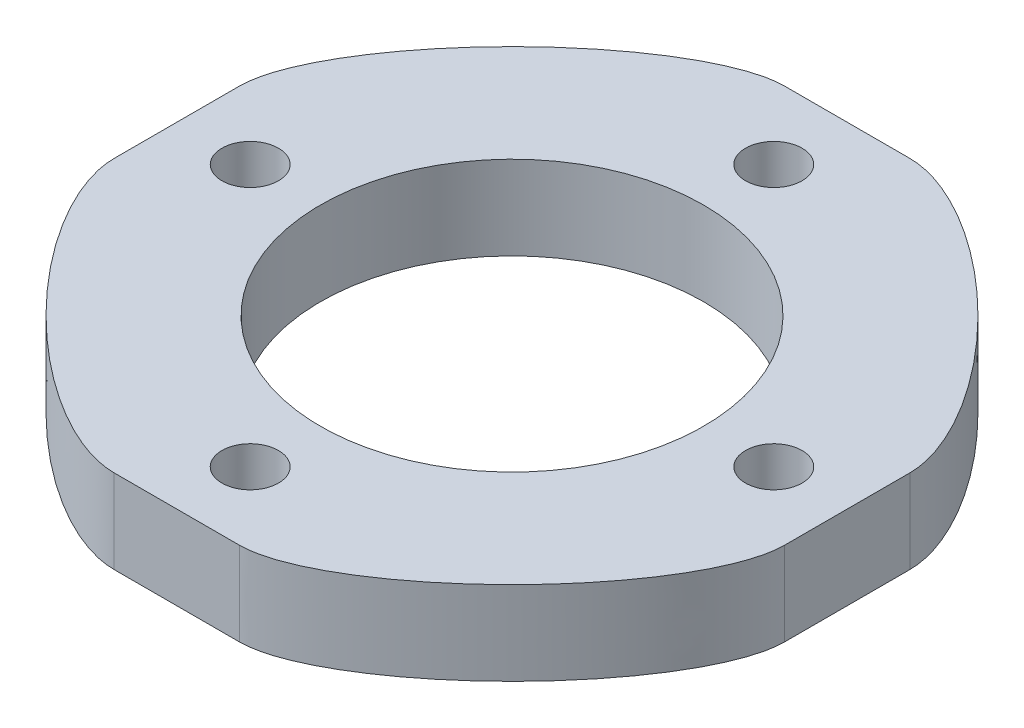
ISO-10303-21;
HEADER;
FILE_DESCRIPTION(('STEP AP214'),'2;1');
FILE_NAME('part.step','',(''),(''),'','','');
FILE_SCHEMA(('AUTOMOTIVE_DESIGN { 1 0 10303 214 1 1 1 1 }'));
ENDSEC;
DATA;
#1=APPLICATION_CONTEXT('core data for automotive mechanical design processes');
#2=APPLICATION_PROTOCOL_DEFINITION('international standard','automotive_design',2000,#1);
#3=PRODUCT_CONTEXT('',#1,'mechanical');
#4=PRODUCT('Part','Part','',(#3));
#5=PRODUCT_RELATED_PRODUCT_CATEGORY('part','',(#4));
#6=PRODUCT_DEFINITION_FORMATION('','',#4);
#7=PRODUCT_DEFINITION_CONTEXT('part definition',#1,'design');
#8=PRODUCT_DEFINITION('design','',#6,#7);
#9=PRODUCT_DEFINITION_SHAPE('','',#8);
#10=(LENGTH_UNIT() NAMED_UNIT(*) SI_UNIT(.MILLI.,.METRE.));
#11=(NAMED_UNIT(*) PLANE_ANGLE_UNIT() SI_UNIT($,.RADIAN.));
#12=(NAMED_UNIT(*) SI_UNIT($,.STERADIAN.) SOLID_ANGLE_UNIT());
#13=UNCERTAINTY_MEASURE_WITH_UNIT(LENGTH_MEASURE(1.E-05),#10,'distance_accuracy_value','');
#14=(GEOMETRIC_REPRESENTATION_CONTEXT(3) GLOBAL_UNCERTAINTY_ASSIGNED_CONTEXT((#13)) GLOBAL_UNIT_ASSIGNED_CONTEXT((#10,
#11,#12)) REPRESENTATION_CONTEXT('',''));
#15=CARTESIAN_POINT('',(0.,0.,0.));
#16=DIRECTION('',(0.,0.,1.));
#17=DIRECTION('',(1.,0.,0.));
#18=AXIS2_PLACEMENT_3D('',#15,#16,#17);
#19=CARTESIAN_POINT('',(0.,4.,0.));
#20=DIRECTION('',(1.,0.,0.));
#21=DIRECTION('',(0.,0.,-1.));
#22=AXIS2_PLACEMENT_3D('',#19,#20,#21);
#23=PLANE('',#22);
#24=DIRECTION('',(0.,0.,1.));
#25=VECTOR('',#24,1.);
#26=CARTESIAN_POINT('',(0.,4.,0.));
#27=LINE('',#26,#25);
#28=CARTESIAN_POINT('',(0.,4.,13.));
#29=VERTEX_POINT('',#28);
#30=CARTESIAN_POINT('',(0.,4.,19.));
#31=VERTEX_POINT('',#30);
#32=EDGE_CURVE('E137',#29,#31,#27,.T.);
#33=ORIENTED_EDGE('',*,*,#32,.F.);
#34=CARTESIAN_POINT('',(0.,-0.200000000000001,13.));
#35=CARTESIAN_POINT('',(0.,1.26666666666667,13.));
#36=CARTESIAN_POINT('',(0.,2.73333333333333,13.));
#37=CARTESIAN_POINT('',(0.,4.2,13.));
#38=(BOUNDED_CURVE() B_SPLINE_CURVE(3,(#34,#35,#36,#37),.UNSPECIFIED.,.F.,
.F.) B_SPLINE_CURVE_WITH_KNOTS((4,4),(-0.0002,0.0042),
.UNSPECIFIED.) CURVE() GEOMETRIC_REPRESENTATION_ITEM() RATIONAL_B_SPLINE_CURVE((1.,1.,1.,1.)) REPRESENTATION_ITEM(''));
#39=CARTESIAN_POINT('',(0.,0.,13.));
#40=VERTEX_POINT('',#39);
#41=EDGE_CURVE('E117',#29,#40,#38,.F.);
#42=ORIENTED_EDGE('',*,*,#41,.T.);
#43=DIRECTION('',(0.,0.,1.));
#44=VECTOR('',#43,1.);
#45=CARTESIAN_POINT('',(0.,0.,0.));
#46=LINE('',#45,#44);
#47=CARTESIAN_POINT('',(0.,0.,19.));
#48=VERTEX_POINT('',#47);
#49=EDGE_CURVE('E134',#40,#48,#46,.T.);
#50=ORIENTED_EDGE('',*,*,#49,.T.);
#51=CARTESIAN_POINT('',(0.,4.2,19.));
#52=CARTESIAN_POINT('',(0.,2.73333333333333,19.));
#53=CARTESIAN_POINT('',(0.,1.26666666666667,19.));
#54=CARTESIAN_POINT('',(0.,-0.200000000000001,19.));
#55=(BOUNDED_CURVE() B_SPLINE_CURVE(3,(#51,#52,#53,#54),.UNSPECIFIED.,.F.,
.F.) B_SPLINE_CURVE_WITH_KNOTS((4,4),(-0.0002,0.0042),
.UNSPECIFIED.) CURVE() GEOMETRIC_REPRESENTATION_ITEM() RATIONAL_B_SPLINE_CURVE((1.,1.,1.,1.)) REPRESENTATION_ITEM(''));
#56=EDGE_CURVE('E139',#48,#31,#55,.F.);
#57=ORIENTED_EDGE('',*,*,#56,.T.);
#58=EDGE_LOOP('',(#33,#42,#50,#57));
#59=FACE_BOUND('',#58,.T.);
#60=ADVANCED_FACE('F38',(#59),#23,.F.);
#61=CARTESIAN_POINT('',(0.,4.,32.));
#62=DIRECTION('',(0.,0.,-1.));
#63=DIRECTION('',(-1.,0.,0.));
#64=AXIS2_PLACEMENT_3D('',#61,#62,#63);
#65=PLANE('',#64);
#66=DIRECTION('',(1.,0.,0.));
#67=VECTOR('',#66,1.);
#68=CARTESIAN_POINT('',(0.,0.,32.));
#69=LINE('',#68,#67);
#70=CARTESIAN_POINT('',(13.,0.,32.));
#71=VERTEX_POINT('',#70);
#72=CARTESIAN_POINT('',(19.,0.,32.));
#73=VERTEX_POINT('',#72);
#74=EDGE_CURVE('E145',#71,#73,#69,.T.);
#75=ORIENTED_EDGE('',*,*,#74,.T.);
#76=CARTESIAN_POINT('',(19.,4.2,32.));
#77=CARTESIAN_POINT('',(19.,2.73333333333333,32.));
#78=CARTESIAN_POINT('',(19.,1.26666666666667,32.));
#79=CARTESIAN_POINT('',(19.,-0.200000000000001,32.));
#80=(BOUNDED_CURVE() B_SPLINE_CURVE(3,(#76,#77,#78,#79),.UNSPECIFIED.,.F.,
.F.) B_SPLINE_CURVE_WITH_KNOTS((4,4),(-0.0002,0.0042),
.UNSPECIFIED.) CURVE() GEOMETRIC_REPRESENTATION_ITEM() RATIONAL_B_SPLINE_CURVE((1.,1.,1.,1.)) REPRESENTATION_ITEM(''));
#81=CARTESIAN_POINT('',(19.,4.,32.));
#82=VERTEX_POINT('',#81);
#83=EDGE_CURVE('E12',#73,#82,#80,.F.);
#84=ORIENTED_EDGE('',*,*,#83,.T.);
#85=DIRECTION('',(1.,0.,0.));
#86=VECTOR('',#85,1.);
#87=CARTESIAN_POINT('',(0.,4.,32.));
#88=LINE('',#87,#86);
#89=CARTESIAN_POINT('',(13.,4.,32.));
#90=VERTEX_POINT('',#89);
#91=EDGE_CURVE('E237',#90,#82,#88,.T.);
#92=ORIENTED_EDGE('',*,*,#91,.F.);
#93=CARTESIAN_POINT('',(13.,-0.200000000000001,32.));
#94=CARTESIAN_POINT('',(13.,1.26666666666667,32.));
#95=CARTESIAN_POINT('',(13.,2.73333333333333,32.));
#96=CARTESIAN_POINT('',(13.,4.2,32.));
#97=(BOUNDED_CURVE() B_SPLINE_CURVE(3,(#93,#94,#95,#96),.UNSPECIFIED.,.F.,
.F.) B_SPLINE_CURVE_WITH_KNOTS((4,4),(-0.0002,0.0042),
.UNSPECIFIED.) CURVE() GEOMETRIC_REPRESENTATION_ITEM() RATIONAL_B_SPLINE_CURVE((1.,1.,1.,1.)) REPRESENTATION_ITEM(''));
#98=EDGE_CURVE('E52',#90,#71,#97,.F.);
#99=ORIENTED_EDGE('',*,*,#98,.T.);
#100=EDGE_LOOP('',(#75,#84,#92,#99));
#101=FACE_BOUND('',#100,.T.);
#102=ADVANCED_FACE('F306',(#101),#65,.F.);
#103=CARTESIAN_POINT('',(32.,4.,0.));
#104=DIRECTION('',(-1.,0.,0.));
#105=DIRECTION('',(0.,0.,1.));
#106=AXIS2_PLACEMENT_3D('',#103,#104,#105);
#107=PLANE('',#106);
#108=DIRECTION('',(0.,0.,-1.));
#109=VECTOR('',#108,1.);
#110=CARTESIAN_POINT('',(32.,0.,0.));
#111=LINE('',#110,#109);
#112=CARTESIAN_POINT('',(32.,0.,19.));
#113=VERTEX_POINT('',#112);
#114=CARTESIAN_POINT('',(32.,0.,13.));
#115=VERTEX_POINT('',#114);
#116=EDGE_CURVE('E149',#113,#115,#111,.T.);
#117=ORIENTED_EDGE('',*,*,#116,.T.);
#118=CARTESIAN_POINT('',(32.,4.2,13.));
#119=CARTESIAN_POINT('',(32.,2.73333333333333,13.));
#120=CARTESIAN_POINT('',(32.,1.26666666666667,13.));
#121=CARTESIAN_POINT('',(32.,-0.200000000000001,13.));
#122=(BOUNDED_CURVE() B_SPLINE_CURVE(3,(#118,#119,#120,#121),.UNSPECIFIED.,.F.,
.F.) B_SPLINE_CURVE_WITH_KNOTS((4,4),(-0.0002,0.0042),
.UNSPECIFIED.) CURVE() GEOMETRIC_REPRESENTATION_ITEM() RATIONAL_B_SPLINE_CURVE((1.,1.,1.,1.)) REPRESENTATION_ITEM(''));
#123=CARTESIAN_POINT('',(32.,4.,13.));
#124=VERTEX_POINT('',#123);
#125=EDGE_CURVE('E59',#115,#124,#122,.F.);
#126=ORIENTED_EDGE('',*,*,#125,.T.);
#127=DIRECTION('',(0.,0.,-1.));
#128=VECTOR('',#127,1.);
#129=CARTESIAN_POINT('',(32.,4.,0.));
#130=LINE('',#129,#128);
#131=CARTESIAN_POINT('',(32.,4.,19.));
#132=VERTEX_POINT('',#131);
#133=EDGE_CURVE('E219',#132,#124,#130,.T.);
#134=ORIENTED_EDGE('',*,*,#133,.F.);
#135=CARTESIAN_POINT('',(32.,-0.200000000000001,19.));
#136=CARTESIAN_POINT('',(32.,1.26666666666667,19.));
#137=CARTESIAN_POINT('',(32.,2.73333333333333,19.));
#138=CARTESIAN_POINT('',(32.,4.2,19.));
#139=(BOUNDED_CURVE() B_SPLINE_CURVE(3,(#135,#136,#137,#138),.UNSPECIFIED.,.F.,
.F.) B_SPLINE_CURVE_WITH_KNOTS((4,4),(-0.0002,0.0042),
.UNSPECIFIED.) CURVE() GEOMETRIC_REPRESENTATION_ITEM() RATIONAL_B_SPLINE_CURVE((1.,1.,1.,1.)) REPRESENTATION_ITEM(''));
#140=EDGE_CURVE('E337',#132,#113,#139,.F.);
#141=ORIENTED_EDGE('',*,*,#140,.T.);
#142=EDGE_LOOP('',(#117,#126,#134,#141));
#143=FACE_BOUND('',#142,.T.);
#144=ADVANCED_FACE('F312',(#143),#107,.F.);
#145=CARTESIAN_POINT('',(0.,4.,0.));
#146=DIRECTION('',(0.,0.,1.));
#147=DIRECTION('',(1.,0.,0.));
#148=AXIS2_PLACEMENT_3D('',#145,#146,#147);
#149=PLANE('',#148);
#150=DIRECTION('',(-1.,0.,0.));
#151=VECTOR('',#150,1.);
#152=CARTESIAN_POINT('',(0.,0.,0.));
#153=LINE('',#152,#151);
#154=CARTESIAN_POINT('',(19.,0.,0.));
#155=VERTEX_POINT('',#154);
#156=CARTESIAN_POINT('',(13.,0.,0.));
#157=VERTEX_POINT('',#156);
#158=EDGE_CURVE('E328',#155,#157,#153,.T.);
#159=ORIENTED_EDGE('',*,*,#158,.T.);
#160=CARTESIAN_POINT('',(13.,4.2,0.));
#161=CARTESIAN_POINT('',(13.,2.73333333333333,0.));
#162=CARTESIAN_POINT('',(13.,1.26666666666667,0.));
#163=CARTESIAN_POINT('',(13.,-0.200000000000001,0.));
#164=(BOUNDED_CURVE() B_SPLINE_CURVE(3,(#160,#161,#162,#163),.UNSPECIFIED.,.F.,
.F.) B_SPLINE_CURVE_WITH_KNOTS((4,4),(-0.0002,0.0042),
.UNSPECIFIED.) CURVE() GEOMETRIC_REPRESENTATION_ITEM() RATIONAL_B_SPLINE_CURVE((1.,1.,1.,1.)) REPRESENTATION_ITEM(''));
#165=CARTESIAN_POINT('',(13.,4.,0.));
#166=VERTEX_POINT('',#165);
#167=EDGE_CURVE('E119',#157,#166,#164,.F.);
#168=ORIENTED_EDGE('',*,*,#167,.T.);
#169=DIRECTION('',(-1.,0.,0.));
#170=VECTOR('',#169,1.);
#171=CARTESIAN_POINT('',(0.,4.,0.));
#172=LINE('',#171,#170);
#173=CARTESIAN_POINT('',(19.,4.,0.));
#174=VERTEX_POINT('',#173);
#175=EDGE_CURVE('E211',#174,#166,#172,.T.);
#176=ORIENTED_EDGE('',*,*,#175,.F.);
#177=CARTESIAN_POINT('',(19.,-0.200000000000001,0.));
#178=CARTESIAN_POINT('',(19.,1.26666666666667,0.));
#179=CARTESIAN_POINT('',(19.,2.73333333333333,0.));
#180=CARTESIAN_POINT('',(19.,4.2,0.));
#181=(BOUNDED_CURVE() B_SPLINE_CURVE(3,(#177,#178,#179,#180),.UNSPECIFIED.,.F.,
.F.) B_SPLINE_CURVE_WITH_KNOTS((4,4),(-0.0002,0.0042),
.UNSPECIFIED.) CURVE() GEOMETRIC_REPRESENTATION_ITEM() RATIONAL_B_SPLINE_CURVE((1.,1.,1.,1.)) REPRESENTATION_ITEM(''));
#182=EDGE_CURVE('E126',#174,#155,#181,.F.);
#183=ORIENTED_EDGE('',*,*,#182,.T.);
#184=EDGE_LOOP('',(#159,#168,#176,#183));
#185=FACE_BOUND('',#184,.T.);
#186=ADVANCED_FACE('F190',(#185),#149,.F.);
#187=CARTESIAN_POINT('',(0.,4.,0.));
#188=DIRECTION('',(0.,1.,0.));
#189=DIRECTION('',(0.,0.,1.));
#190=AXIS2_PLACEMENT_3D('',#187,#188,#189);
#191=PLANE('',#190);
#192=CARTESIAN_POINT('',(3.5,4.,16.));
#193=DIRECTION('',(0.,-1.,0.));
#194=DIRECTION('',(0.,0.,-1.));
#195=AXIS2_PLACEMENT_3D('',#192,#193,#194);
#196=CIRCLE('',#195,1.35);
#197=CARTESIAN_POINT('',(3.5,4.,14.65));
#198=VERTEX_POINT('',#197);
#199=EDGE_CURVE('E268',#198,#198,#196,.T.);
#200=ORIENTED_EDGE('',*,*,#199,.T.);
#201=EDGE_LOOP('',(#200));
#202=FACE_BOUND('',#201,.T.);
#203=CARTESIAN_POINT('',(16.,4.,3.5));
#204=DIRECTION('',(0.,-1.,0.));
#205=DIRECTION('',(0.,0.,-1.));
#206=AXIS2_PLACEMENT_3D('',#203,#204,#205);
#207=CIRCLE('',#206,1.35);
#208=CARTESIAN_POINT('',(16.,4.,2.15));
#209=VERTEX_POINT('',#208);
#210=EDGE_CURVE('E257',#209,#209,#207,.T.);
#211=ORIENTED_EDGE('',*,*,#210,.T.);
#212=EDGE_LOOP('',(#211));
#213=FACE_BOUND('',#212,.T.);
#214=CARTESIAN_POINT('',(28.5,4.,16.));
#215=DIRECTION('',(0.,-1.,0.));
#216=DIRECTION('',(0.,0.,-1.));
#217=AXIS2_PLACEMENT_3D('',#214,#215,#216);
#218=CIRCLE('',#217,1.35);
#219=CARTESIAN_POINT('',(28.5,4.,14.65));
#220=VERTEX_POINT('',#219);
#221=EDGE_CURVE('E256',#220,#220,#218,.T.);
#222=ORIENTED_EDGE('',*,*,#221,.T.);
#223=EDGE_LOOP('',(#222));
#224=FACE_BOUND('',#223,.T.);
#225=CARTESIAN_POINT('',(16.,4.,28.5));
#226=DIRECTION('',(0.,-1.,0.));
#227=DIRECTION('',(0.,0.,-1.));
#228=AXIS2_PLACEMENT_3D('',#225,#226,#227);
#229=CIRCLE('',#228,1.35);
#230=CARTESIAN_POINT('',(16.,4.,27.15));
#231=VERTEX_POINT('',#230);
#232=EDGE_CURVE('E251',#231,#231,#229,.T.);
#233=ORIENTED_EDGE('',*,*,#232,.T.);
#234=EDGE_LOOP('',(#233));
#235=FACE_BOUND('',#234,.T.);
#236=CARTESIAN_POINT('',(16.,4.,16.));
#237=DIRECTION('',(0.,-1.,0.));
#238=DIRECTION('',(0.,0.,-1.));
#239=AXIS2_PLACEMENT_3D('',#236,#237,#238);
#240=CIRCLE('',#239,9.15);
#241=CARTESIAN_POINT('',(16.,4.,6.85));
#242=VERTEX_POINT('',#241);
#243=EDGE_CURVE('E146',#242,#242,#240,.T.);
#244=ORIENTED_EDGE('',*,*,#243,.T.);
#245=EDGE_LOOP('',(#244));
#246=FACE_BOUND('',#245,.T.);
#247=ORIENTED_EDGE('',*,*,#175,.T.);
#248=CARTESIAN_POINT('',(0.,4.,13.));
#249=CARTESIAN_POINT('',(0.,4.,0.));
#250=CARTESIAN_POINT('',(13.,4.,0.));
#251=(BOUNDED_CURVE() B_SPLINE_CURVE(2,(#248,#249,#250),.UNSPECIFIED.,.F.,
.F.) B_SPLINE_CURVE_WITH_KNOTS((3,3),(0.,1.),
.UNSPECIFIED.) CURVE() GEOMETRIC_REPRESENTATION_ITEM() RATIONAL_B_SPLINE_CURVE((1.,
0.333333333333333,1.)) REPRESENTATION_ITEM(''));
#252=EDGE_CURVE('E394',#166,#29,#251,.F.);
#253=ORIENTED_EDGE('',*,*,#252,.T.);
#254=ORIENTED_EDGE('',*,*,#32,.T.);
#255=CARTESIAN_POINT('',(13.,4.,32.));
#256=CARTESIAN_POINT('',(0.,4.,32.));
#257=CARTESIAN_POINT('',(0.,4.,19.));
#258=(BOUNDED_CURVE() B_SPLINE_CURVE(2,(#255,#256,#257),.UNSPECIFIED.,.F.,
.F.) B_SPLINE_CURVE_WITH_KNOTS((3,3),(0.,1.),
.UNSPECIFIED.) CURVE() GEOMETRIC_REPRESENTATION_ITEM() RATIONAL_B_SPLINE_CURVE((1.,
0.333333333333333,1.)) REPRESENTATION_ITEM(''));
#259=EDGE_CURVE('E391',#31,#90,#258,.F.);
#260=ORIENTED_EDGE('',*,*,#259,.T.);
#261=ORIENTED_EDGE('',*,*,#91,.T.);
#262=CARTESIAN_POINT('',(32.,4.,19.));
#263=CARTESIAN_POINT('',(32.,4.,32.));
#264=CARTESIAN_POINT('',(19.,4.,32.));
#265=(BOUNDED_CURVE() B_SPLINE_CURVE(2,(#262,#263,#264),.UNSPECIFIED.,.F.,
.F.) B_SPLINE_CURVE_WITH_KNOTS((3,3),(0.,1.),
.UNSPECIFIED.) CURVE() GEOMETRIC_REPRESENTATION_ITEM() RATIONAL_B_SPLINE_CURVE((1.,
0.333333333333333,1.)) REPRESENTATION_ITEM(''));
#266=EDGE_CURVE('E67',#82,#132,#265,.F.);
#267=ORIENTED_EDGE('',*,*,#266,.T.);
#268=ORIENTED_EDGE('',*,*,#133,.T.);
#269=CARTESIAN_POINT('',(19.,4.,0.));
#270=CARTESIAN_POINT('',(32.,4.,0.));
#271=CARTESIAN_POINT('',(32.,4.,13.));
#272=(BOUNDED_CURVE() B_SPLINE_CURVE(2,(#269,#270,#271),.UNSPECIFIED.,.F.,
.F.) B_SPLINE_CURVE_WITH_KNOTS((3,3),(0.,1.),
.UNSPECIFIED.) CURVE() GEOMETRIC_REPRESENTATION_ITEM() RATIONAL_B_SPLINE_CURVE((1.,
0.333333333333333,1.)) REPRESENTATION_ITEM(''));
#273=EDGE_CURVE('E344',#124,#174,#272,.F.);
#274=ORIENTED_EDGE('',*,*,#273,.T.);
#275=EDGE_LOOP('',(#247,#253,#254,#260,#261,#267,#268,#274));
#276=FACE_BOUND('',#275,.T.);
#277=ADVANCED_FACE('F186',(#202,#213,#224,#235,#246,#276),#191,.T.);
#278=CARTESIAN_POINT('',(0.,0.,0.));
#279=DIRECTION('',(0.,1.,0.));
#280=DIRECTION('',(0.,0.,1.));
#281=AXIS2_PLACEMENT_3D('',#278,#279,#280);
#282=PLANE('',#281);
#283=CARTESIAN_POINT('',(3.5,0.,16.));
#284=DIRECTION('',(0.,-1.,0.));
#285=DIRECTION('',(0.,0.,-1.));
#286=AXIS2_PLACEMENT_3D('',#283,#284,#285);
#287=CIRCLE('',#286,1.35);
#288=CARTESIAN_POINT('',(3.5,0.,14.65));
#289=VERTEX_POINT('',#288);
#290=EDGE_CURVE('E265',#289,#289,#287,.T.);
#291=ORIENTED_EDGE('',*,*,#290,.F.);
#292=EDGE_LOOP('',(#291));
#293=FACE_BOUND('',#292,.T.);
#294=CARTESIAN_POINT('',(16.,0.,3.5));
#295=DIRECTION('',(0.,-1.,0.));
#296=DIRECTION('',(0.,0.,-1.));
#297=AXIS2_PLACEMENT_3D('',#294,#295,#296);
#298=CIRCLE('',#297,1.35);
#299=CARTESIAN_POINT('',(16.,0.,2.15));
#300=VERTEX_POINT('',#299);
#301=EDGE_CURVE('E271',#300,#300,#298,.T.);
#302=ORIENTED_EDGE('',*,*,#301,.F.);
#303=EDGE_LOOP('',(#302));
#304=FACE_BOUND('',#303,.T.);
#305=CARTESIAN_POINT('',(28.5,0.,16.));
#306=DIRECTION('',(0.,-1.,0.));
#307=DIRECTION('',(0.,0.,-1.));
#308=AXIS2_PLACEMENT_3D('',#305,#306,#307);
#309=CIRCLE('',#308,1.35);
#310=CARTESIAN_POINT('',(28.5,0.,14.65));
#311=VERTEX_POINT('',#310);
#312=EDGE_CURVE('E253',#311,#311,#309,.T.);
#313=ORIENTED_EDGE('',*,*,#312,.F.);
#314=EDGE_LOOP('',(#313));
#315=FACE_BOUND('',#314,.T.);
#316=CARTESIAN_POINT('',(16.,0.,28.5));
#317=DIRECTION('',(0.,-1.,0.));
#318=DIRECTION('',(0.,0.,-1.));
#319=AXIS2_PLACEMENT_3D('',#316,#317,#318);
#320=CIRCLE('',#319,1.35);
#321=CARTESIAN_POINT('',(16.,0.,27.15));
#322=VERTEX_POINT('',#321);
#323=EDGE_CURVE('E260',#322,#322,#320,.T.);
#324=ORIENTED_EDGE('',*,*,#323,.F.);
#325=EDGE_LOOP('',(#324));
#326=FACE_BOUND('',#325,.T.);
#327=CARTESIAN_POINT('',(16.,0.,16.));
#328=DIRECTION('',(0.,-1.,0.));
#329=DIRECTION('',(0.,0.,-1.));
#330=AXIS2_PLACEMENT_3D('',#327,#328,#329);
#331=CIRCLE('',#330,9.15);
#332=CARTESIAN_POINT('',(16.,0.,6.85));
#333=VERTEX_POINT('',#332);
#334=EDGE_CURVE('E152',#333,#333,#331,.T.);
#335=ORIENTED_EDGE('',*,*,#334,.F.);
#336=EDGE_LOOP('',(#335));
#337=FACE_BOUND('',#336,.T.);
#338=ORIENTED_EDGE('',*,*,#49,.F.);
#339=CARTESIAN_POINT('',(13.,0.,0.));
#340=CARTESIAN_POINT('',(0.,0.,0.));
#341=CARTESIAN_POINT('',(0.,0.,13.));
#342=(BOUNDED_CURVE() B_SPLINE_CURVE(2,(#339,#340,#341),.UNSPECIFIED.,.F.,
.F.) B_SPLINE_CURVE_WITH_KNOTS((3,3),(0.,1.),
.UNSPECIFIED.) CURVE() GEOMETRIC_REPRESENTATION_ITEM() RATIONAL_B_SPLINE_CURVE((1.,
0.333333333333333,1.)) REPRESENTATION_ITEM(''));
#343=EDGE_CURVE('E112',#40,#157,#342,.F.);
#344=ORIENTED_EDGE('',*,*,#343,.T.);
#345=ORIENTED_EDGE('',*,*,#158,.F.);
#346=CARTESIAN_POINT('',(32.,0.,13.));
#347=CARTESIAN_POINT('',(32.,0.,0.));
#348=CARTESIAN_POINT('',(19.,0.,0.));
#349=(BOUNDED_CURVE() B_SPLINE_CURVE(2,(#346,#347,#348),.UNSPECIFIED.,.F.,
.F.) B_SPLINE_CURVE_WITH_KNOTS((3,3),(0.,1.),
.UNSPECIFIED.) CURVE() GEOMETRIC_REPRESENTATION_ITEM() RATIONAL_B_SPLINE_CURVE((1.,
0.333333333333333,1.)) REPRESENTATION_ITEM(''));
#350=EDGE_CURVE('E127',#155,#115,#349,.F.);
#351=ORIENTED_EDGE('',*,*,#350,.T.);
#352=ORIENTED_EDGE('',*,*,#116,.F.);
#353=CARTESIAN_POINT('',(19.,0.,32.));
#354=CARTESIAN_POINT('',(32.,0.,32.));
#355=CARTESIAN_POINT('',(32.,0.,19.));
#356=(BOUNDED_CURVE() B_SPLINE_CURVE(2,(#353,#354,#355),.UNSPECIFIED.,.F.,
.F.) B_SPLINE_CURVE_WITH_KNOTS((3,3),(0.,1.),
.UNSPECIFIED.) CURVE() GEOMETRIC_REPRESENTATION_ITEM() RATIONAL_B_SPLINE_CURVE((1.,
0.333333333333333,1.)) REPRESENTATION_ITEM(''));
#357=EDGE_CURVE('E603',#113,#73,#356,.F.);
#358=ORIENTED_EDGE('',*,*,#357,.T.);
#359=ORIENTED_EDGE('',*,*,#74,.F.);
#360=CARTESIAN_POINT('',(0.,0.,19.));
#361=CARTESIAN_POINT('',(0.,0.,32.));
#362=CARTESIAN_POINT('',(13.,0.,32.));
#363=(BOUNDED_CURVE() B_SPLINE_CURVE(2,(#360,#361,#362),.UNSPECIFIED.,.F.,
.F.) B_SPLINE_CURVE_WITH_KNOTS((3,3),(0.,1.),
.UNSPECIFIED.) CURVE() GEOMETRIC_REPRESENTATION_ITEM() RATIONAL_B_SPLINE_CURVE((1.,
0.333333333333333,1.)) REPRESENTATION_ITEM(''));
#364=EDGE_CURVE('E138',#71,#48,#363,.F.);
#365=ORIENTED_EDGE('',*,*,#364,.T.);
#366=EDGE_LOOP('',(#338,#344,#345,#351,#352,#358,#359,#365));
#367=FACE_BOUND('',#366,.T.);
#368=ADVANCED_FACE('F142',(#293,#304,#315,#326,#337,#367),#282,.F.);
#369=CARTESIAN_POINT('',(16.,4.,16.));
#370=DIRECTION('',(0.,-1.,0.));
#371=DIRECTION('',(0.,0.,-1.));
#372=AXIS2_PLACEMENT_3D('',#369,#370,#371);
#373=CYLINDRICAL_SURFACE('',#372,9.15);
#374=ORIENTED_EDGE('',*,*,#243,.F.);
#375=EDGE_LOOP('',(#374));
#376=FACE_BOUND('',#375,.T.);
#377=ORIENTED_EDGE('',*,*,#334,.T.);
#378=EDGE_LOOP('',(#377));
#379=FACE_BOUND('',#378,.T.);
#380=ADVANCED_FACE('F185',(#376,#379),#373,.F.);
#381=CARTESIAN_POINT('',(16.,4.,28.5));
#382=DIRECTION('',(0.,-1.,0.));
#383=DIRECTION('',(0.,0.,-1.));
#384=AXIS2_PLACEMENT_3D('',#381,#382,#383);
#385=CYLINDRICAL_SURFACE('',#384,1.35);
#386=ORIENTED_EDGE('',*,*,#232,.F.);
#387=EDGE_LOOP('',(#386));
#388=FACE_BOUND('',#387,.T.);
#389=ORIENTED_EDGE('',*,*,#323,.T.);
#390=EDGE_LOOP('',(#389));
#391=FACE_BOUND('',#390,.T.);
#392=ADVANCED_FACE('F295',(#388,#391),#385,.F.);
#393=CARTESIAN_POINT('',(28.5,4.,16.));
#394=DIRECTION('',(0.,-1.,0.));
#395=DIRECTION('',(0.,0.,-1.));
#396=AXIS2_PLACEMENT_3D('',#393,#394,#395);
#397=CYLINDRICAL_SURFACE('',#396,1.35);
#398=ORIENTED_EDGE('',*,*,#221,.F.);
#399=EDGE_LOOP('',(#398));
#400=FACE_BOUND('',#399,.T.);
#401=ORIENTED_EDGE('',*,*,#312,.T.);
#402=EDGE_LOOP('',(#401));
#403=FACE_BOUND('',#402,.T.);
#404=ADVANCED_FACE('F283',(#400,#403),#397,.F.);
#405=CARTESIAN_POINT('',(16.,4.,3.5));
#406=DIRECTION('',(0.,-1.,0.));
#407=DIRECTION('',(0.,0.,-1.));
#408=AXIS2_PLACEMENT_3D('',#405,#406,#407);
#409=CYLINDRICAL_SURFACE('',#408,1.35);
#410=ORIENTED_EDGE('',*,*,#210,.F.);
#411=EDGE_LOOP('',(#410));
#412=FACE_BOUND('',#411,.T.);
#413=ORIENTED_EDGE('',*,*,#301,.T.);
#414=EDGE_LOOP('',(#413));
#415=FACE_BOUND('',#414,.T.);
#416=ADVANCED_FACE('F279',(#412,#415),#409,.F.);
#417=CARTESIAN_POINT('',(3.5,4.,16.));
#418=DIRECTION('',(0.,-1.,0.));
#419=DIRECTION('',(0.,0.,-1.));
#420=AXIS2_PLACEMENT_3D('',#417,#418,#419);
#421=CYLINDRICAL_SURFACE('',#420,1.35);
#422=ORIENTED_EDGE('',*,*,#199,.F.);
#423=EDGE_LOOP('',(#422));
#424=FACE_BOUND('',#423,.T.);
#425=ORIENTED_EDGE('',*,*,#290,.T.);
#426=EDGE_LOOP('',(#425));
#427=FACE_BOUND('',#426,.T.);
#428=ADVANCED_FACE('F282',(#424,#427),#421,.F.);
#429=CARTESIAN_POINT('',(0.,4.2,13.));
#430=CARTESIAN_POINT('',(0.,2.73333333333333,13.));
#431=CARTESIAN_POINT('',(0.,1.26666666666667,13.));
#432=CARTESIAN_POINT('',(0.,-0.200000000000001,13.));
#433=CARTESIAN_POINT('',(0.,4.2,0.));
#434=CARTESIAN_POINT('',(0.,2.73333333333333,0.));
#435=CARTESIAN_POINT('',(0.,1.26666666666667,0.));
#436=CARTESIAN_POINT('',(0.,-0.200000000000001,0.));
#437=CARTESIAN_POINT('',(13.,4.2,0.));
#438=CARTESIAN_POINT('',(13.,2.73333333333333,0.));
#439=CARTESIAN_POINT('',(13.,1.26666666666667,0.));
#440=CARTESIAN_POINT('',(13.,-0.200000000000001,0.));
#441=(BOUNDED_SURFACE() B_SPLINE_SURFACE(2,3,((#429,#430,#431,#432),(#433,#434,#435,#436),(#437,
#438,#439,#440)),.UNSPECIFIED.,.F.,.F.,.F.) B_SPLINE_SURFACE_WITH_KNOTS((3,3),(4,4),(0.,1.),
(-0.0002,0.0042),.UNSPECIFIED.) GEOMETRIC_REPRESENTATION_ITEM() RATIONAL_B_SPLINE_SURFACE(((1.,
1.,1.,1.),(0.333333333333333,0.333333333333333,0.333333333333333,0.333333333333333),(1.,1.,1.,1.))) REPRESENTATION_ITEM('') SURFACE());
#442=ORIENTED_EDGE('',*,*,#252,.F.);
#443=ORIENTED_EDGE('',*,*,#167,.F.);
#444=ORIENTED_EDGE('',*,*,#343,.F.);
#445=ORIENTED_EDGE('',*,*,#41,.F.);
#446=EDGE_LOOP('',(#442,#443,#444,#445));
#447=FACE_BOUND('',#446,.T.);
#448=ADVANCED_FACE('F116',(#447),#441,.T.);
#449=CARTESIAN_POINT('',(19.,4.2,0.));
#450=CARTESIAN_POINT('',(19.,2.73333333333333,0.));
#451=CARTESIAN_POINT('',(19.,1.26666666666667,0.));
#452=CARTESIAN_POINT('',(19.,-0.200000000000001,0.));
#453=CARTESIAN_POINT('',(32.,4.2,0.));
#454=CARTESIAN_POINT('',(32.,2.73333333333333,0.));
#455=CARTESIAN_POINT('',(32.,1.26666666666667,0.));
#456=CARTESIAN_POINT('',(32.,-0.200000000000001,0.));
#457=CARTESIAN_POINT('',(32.,4.2,13.));
#458=CARTESIAN_POINT('',(32.,2.73333333333333,13.));
#459=CARTESIAN_POINT('',(32.,1.26666666666667,13.));
#460=CARTESIAN_POINT('',(32.,-0.200000000000001,13.));
#461=(BOUNDED_SURFACE() B_SPLINE_SURFACE(2,3,((#449,#450,#451,#452),(#453,#454,#455,#456),(#457,
#458,#459,#460)),.UNSPECIFIED.,.F.,.F.,.F.) B_SPLINE_SURFACE_WITH_KNOTS((3,3),(4,4),(0.,1.),
(-0.0002,0.0042),.UNSPECIFIED.) GEOMETRIC_REPRESENTATION_ITEM() RATIONAL_B_SPLINE_SURFACE(((1.,
1.,1.,1.),(0.333333333333333,0.333333333333333,0.333333333333333,0.333333333333333),(1.,1.,1.,1.))) REPRESENTATION_ITEM('') SURFACE());
#462=ORIENTED_EDGE('',*,*,#273,.F.);
#463=ORIENTED_EDGE('',*,*,#125,.F.);
#464=ORIENTED_EDGE('',*,*,#350,.F.);
#465=ORIENTED_EDGE('',*,*,#182,.F.);
#466=EDGE_LOOP('',(#462,#463,#464,#465));
#467=FACE_BOUND('',#466,.T.);
#468=ADVANCED_FACE('F342',(#467),#461,.T.);
#469=CARTESIAN_POINT('',(32.,4.2,19.));
#470=CARTESIAN_POINT('',(32.,2.73333333333333,19.));
#471=CARTESIAN_POINT('',(32.,1.26666666666667,19.));
#472=CARTESIAN_POINT('',(32.,-0.200000000000001,19.));
#473=CARTESIAN_POINT('',(32.,4.2,32.));
#474=CARTESIAN_POINT('',(32.,2.73333333333333,32.));
#475=CARTESIAN_POINT('',(32.,1.26666666666667,32.));
#476=CARTESIAN_POINT('',(32.,-0.200000000000001,32.));
#477=CARTESIAN_POINT('',(19.,4.2,32.));
#478=CARTESIAN_POINT('',(19.,2.73333333333333,32.));
#479=CARTESIAN_POINT('',(19.,1.26666666666667,32.));
#480=CARTESIAN_POINT('',(19.,-0.200000000000001,32.));
#481=(BOUNDED_SURFACE() B_SPLINE_SURFACE(2,3,((#469,#470,#471,#472),(#473,#474,#475,#476),(#477,
#478,#479,#480)),.UNSPECIFIED.,.F.,.F.,.F.) B_SPLINE_SURFACE_WITH_KNOTS((3,3),(4,4),(0.,1.),
(-0.0002,0.0042),.UNSPECIFIED.) GEOMETRIC_REPRESENTATION_ITEM() RATIONAL_B_SPLINE_SURFACE(((1.,
1.,1.,1.),(0.333333333333333,0.333333333333333,0.333333333333333,0.333333333333333),(1.,1.,1.,1.))) REPRESENTATION_ITEM('') SURFACE());
#482=ORIENTED_EDGE('',*,*,#266,.F.);
#483=ORIENTED_EDGE('',*,*,#83,.F.);
#484=ORIENTED_EDGE('',*,*,#357,.F.);
#485=ORIENTED_EDGE('',*,*,#140,.F.);
#486=EDGE_LOOP('',(#482,#483,#484,#485));
#487=FACE_BOUND('',#486,.T.);
#488=ADVANCED_FACE('F367',(#487),#481,.T.);
#489=CARTESIAN_POINT('',(13.,4.2,32.));
#490=CARTESIAN_POINT('',(13.,2.73333333333333,32.));
#491=CARTESIAN_POINT('',(13.,1.26666666666667,32.));
#492=CARTESIAN_POINT('',(13.,-0.200000000000001,32.));
#493=CARTESIAN_POINT('',(0.,4.2,32.));
#494=CARTESIAN_POINT('',(0.,2.73333333333333,32.));
#495=CARTESIAN_POINT('',(0.,1.26666666666667,32.));
#496=CARTESIAN_POINT('',(0.,-0.200000000000001,32.));
#497=CARTESIAN_POINT('',(0.,4.2,19.));
#498=CARTESIAN_POINT('',(0.,2.73333333333333,19.));
#499=CARTESIAN_POINT('',(0.,1.26666666666667,19.));
#500=CARTESIAN_POINT('',(0.,-0.200000000000001,19.));
#501=(BOUNDED_SURFACE() B_SPLINE_SURFACE(2,3,((#489,#490,#491,#492),(#493,#494,#495,#496),(#497,
#498,#499,#500)),.UNSPECIFIED.,.F.,.F.,.F.) B_SPLINE_SURFACE_WITH_KNOTS((3,3),(4,4),(0.,1.),
(-0.0002,0.0042),.UNSPECIFIED.) GEOMETRIC_REPRESENTATION_ITEM() RATIONAL_B_SPLINE_SURFACE(((1.,
1.,1.,1.),(0.333333333333333,0.333333333333333,0.333333333333333,0.333333333333333),(1.,1.,1.,1.))) REPRESENTATION_ITEM('') SURFACE());
#502=ORIENTED_EDGE('',*,*,#259,.F.);
#503=ORIENTED_EDGE('',*,*,#56,.F.);
#504=ORIENTED_EDGE('',*,*,#364,.F.);
#505=ORIENTED_EDGE('',*,*,#98,.F.);
#506=EDGE_LOOP('',(#502,#503,#504,#505));
#507=FACE_BOUND('',#506,.T.);
#508=ADVANCED_FACE('F41',(#507),#501,.T.);
#509=CLOSED_SHELL('',(#60,#102,#144,#186,#277,#368,#380,#392,#404,#416,#428,#448,#468,#488,#508));
#510=MANIFOLD_SOLID_BREP('B2',#509);
#511=ADVANCED_BREP_SHAPE_REPRESENTATION('',(#18,#510),#14);
#512=SHAPE_DEFINITION_REPRESENTATION(#9,#511);
ENDSEC;
END-ISO-10303-21;
